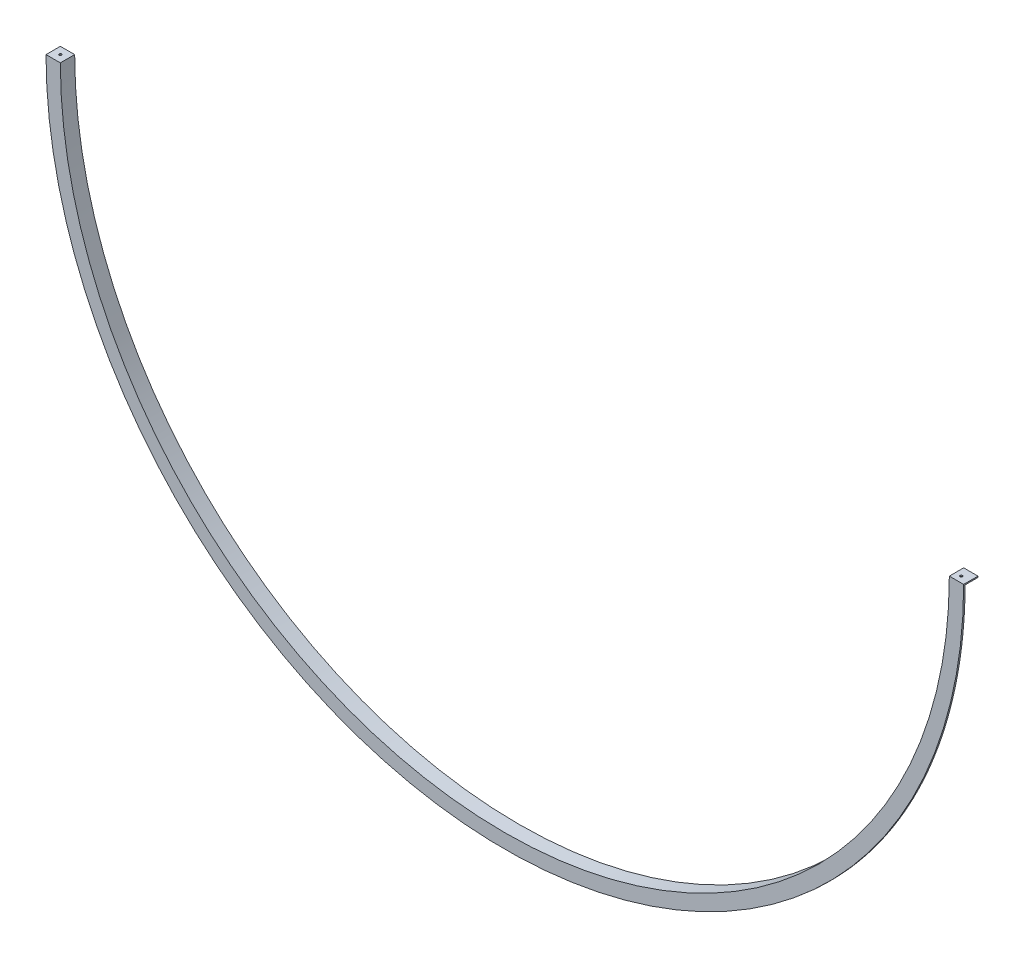
ISO-10303-21;
HEADER;
FILE_DESCRIPTION(('STEP AP214'),'2;1');
FILE_NAME('part.step','',(''),(''),'','','');
FILE_SCHEMA(('AUTOMOTIVE_DESIGN { 1 0 10303 214 1 1 1 1 }'));
ENDSEC;
DATA;
#1=APPLICATION_CONTEXT('core data for automotive mechanical design processes');
#2=APPLICATION_PROTOCOL_DEFINITION('international standard','automotive_design',2000,#1);
#3=PRODUCT_CONTEXT('',#1,'mechanical');
#4=PRODUCT('Part','Part','',(#3));
#5=PRODUCT_RELATED_PRODUCT_CATEGORY('part','',(#4));
#6=PRODUCT_DEFINITION_FORMATION('','',#4);
#7=PRODUCT_DEFINITION_CONTEXT('part definition',#1,'design');
#8=PRODUCT_DEFINITION('design','',#6,#7);
#9=PRODUCT_DEFINITION_SHAPE('','',#8);
#10=(LENGTH_UNIT() NAMED_UNIT(*) SI_UNIT(.MILLI.,.METRE.));
#11=(NAMED_UNIT(*) PLANE_ANGLE_UNIT() SI_UNIT($,.RADIAN.));
#12=(NAMED_UNIT(*) SI_UNIT($,.STERADIAN.) SOLID_ANGLE_UNIT());
#13=UNCERTAINTY_MEASURE_WITH_UNIT(LENGTH_MEASURE(1.E-05),#10,'distance_accuracy_value','');
#14=(GEOMETRIC_REPRESENTATION_CONTEXT(3) GLOBAL_UNCERTAINTY_ASSIGNED_CONTEXT((#13)) GLOBAL_UNIT_ASSIGNED_CONTEXT((#10,
#11,#12)) REPRESENTATION_CONTEXT('',''));
#15=CARTESIAN_POINT('',(0.,0.,0.));
#16=DIRECTION('',(0.,0.,1.));
#17=DIRECTION('',(1.,0.,0.));
#18=AXIS2_PLACEMENT_3D('',#15,#16,#17);
#19=CARTESIAN_POINT('',(-1490.,0.,1.82472373072956E-13));
#20=DIRECTION('',(0.,0.,1.));
#21=DIRECTION('',(1.,0.,0.));
#22=AXIS2_PLACEMENT_3D('',#19,#20,#21);
#23=CYLINDRICAL_SURFACE('',#22,1538.06451612903);
#24=CARTESIAN_POINT('',(-1490.,0.,-4.80645161290322));
#25=DIRECTION('',(0.,0.,1.));
#26=DIRECTION('',(1.,0.,0.));
#27=AXIS2_PLACEMENT_3D('',#24,#25,#26);
#28=CIRCLE('',#27,1538.06451612903);
#29=CARTESIAN_POINT('',(-3028.06451612903,1.07402471120026E-11,-4.80645161290322));
#30=VERTEX_POINT('',#29);
#31=CARTESIAN_POINT('',(48.0593147779553,-4.00000000000034,-4.80645161290322));
#32=VERTEX_POINT('',#31);
#33=EDGE_CURVE('E248',#30,#32,#28,.T.);
#34=ORIENTED_EDGE('',*,*,#33,.T.);
#35=DIRECTION('',(0.,0.,1.));
#36=VECTOR('',#35,1.);
#37=CARTESIAN_POINT('',(48.0593147779553,-4.00000000000034,1.82472373072956E-13));
#38=LINE('',#37,#36);
#39=CARTESIAN_POINT('',(48.0593147779553,-4.00000000000034,0.));
#40=VERTEX_POINT('',#39);
#41=EDGE_CURVE('E167',#32,#40,#38,.T.);
#42=ORIENTED_EDGE('',*,*,#41,.T.);
#43=CARTESIAN_POINT('',(-1490.,0.,0.));
#44=DIRECTION('',(0.,0.,1.));
#45=DIRECTION('',(1.,0.,0.));
#46=AXIS2_PLACEMENT_3D('',#43,#44,#45);
#47=CIRCLE('',#46,1538.06451612903);
#48=CARTESIAN_POINT('',(-3028.06451612903,1.07402471120026E-11,0.));
#49=VERTEX_POINT('',#48);
#50=EDGE_CURVE('E128',#49,#40,#47,.T.);
#51=ORIENTED_EDGE('',*,*,#50,.F.);
#52=DIRECTION('',(0.,0.,-1.));
#53=VECTOR('',#52,1.);
#54=CARTESIAN_POINT('',(-3028.06451612903,1.07402471120026E-11,0.));
#55=LINE('',#54,#53);
#56=EDGE_CURVE('E223',#49,#30,#55,.T.);
#57=ORIENTED_EDGE('',*,*,#56,.T.);
#58=EDGE_LOOP('',(#34,#42,#51,#57));
#59=FACE_BOUND('',#58,.T.);
#60=ADVANCED_FACE('F39',(#59),#23,.T.);
#61=CARTESIAN_POINT('',(-3028.06451612903,1.07402471120026E-11,-4.80645161290322));
#62=DIRECTION('',(0.,0.,-1.));
#63=DIRECTION('',(-1.,0.,0.));
#64=AXIS2_PLACEMENT_3D('',#61,#62,#63);
#65=PLANE('',#64);
#66=CARTESIAN_POINT('',(-1490.,0.,-4.80645161290322));
#67=DIRECTION('',(0.,0.,1.));
#68=DIRECTION('',(1.,0.,0.));
#69=AXIS2_PLACEMENT_3D('',#66,#67,#68);
#70=CIRCLE('',#69,1494.8064516129);
#71=CARTESIAN_POINT('',(-2984.80109973988,-3.99999999997916,-4.80645161290322));
#72=VERTEX_POINT('',#71);
#73=CARTESIAN_POINT('',(4.80109973988152,-4.00000000000003,-4.80645161290322));
#74=VERTEX_POINT('',#73);
#75=EDGE_CURVE('E244',#72,#74,#70,.T.);
#76=ORIENTED_EDGE('',*,*,#75,.T.);
#77=DIRECTION('',(1.,0.,0.));
#78=VECTOR('',#77,1.);
#79=CARTESIAN_POINT('',(-3028.06451612903,-3.99999999997886,-4.80645161290322));
#80=LINE('',#79,#78);
#81=EDGE_CURVE('E163',#74,#32,#80,.T.);
#82=ORIENTED_EDGE('',*,*,#81,.T.);
#83=ORIENTED_EDGE('',*,*,#33,.F.);
#84=DIRECTION('',(1.,0.,0.));
#85=VECTOR('',#84,1.);
#86=CARTESIAN_POINT('',(-3028.06451612903,1.07402471120026E-11,-4.80645161290322));
#87=LINE('',#86,#85);
#88=CARTESIAN_POINT('',(-3028.,1.07397965982815E-11,-4.80645161290322));
#89=VERTEX_POINT('',#88);
#90=EDGE_CURVE('E227',#30,#89,#87,.T.);
#91=ORIENTED_EDGE('',*,*,#90,.T.);
#92=DIRECTION('',(0.,1.,0.));
#93=VECTOR('',#92,1.);
#94=CARTESIAN_POINT('',(-3028.,1.07397965982815E-11,-4.80645161290322));
#95=LINE('',#94,#93);
#96=CARTESIAN_POINT('',(-3028.,-3.99999999997886,-4.80645161290322));
#97=VERTEX_POINT('',#96);
#98=EDGE_CURVE('E55',#97,#89,#95,.T.);
#99=ORIENTED_EDGE('',*,*,#98,.F.);
#100=DIRECTION('',(1.,0.,0.));
#101=VECTOR('',#100,1.);
#102=CARTESIAN_POINT('',(-3028.06451612903,-3.99999999997886,-4.80645161290322));
#103=LINE('',#102,#101);
#104=EDGE_CURVE('E201',#97,#72,#103,.T.);
#105=ORIENTED_EDGE('',*,*,#104,.T.);
#106=EDGE_LOOP('',(#76,#82,#83,#91,#99,#105));
#107=FACE_BOUND('',#106,.T.);
#108=ADVANCED_FACE('F273',(#107),#65,.T.);
#109=CARTESIAN_POINT('',(-1490.,0.,1.82472373072956E-13));
#110=DIRECTION('',(0.,0.,1.));
#111=DIRECTION('',(1.,0.,0.));
#112=AXIS2_PLACEMENT_3D('',#109,#110,#111);
#113=CYLINDRICAL_SURFACE('',#112,1494.8064516129);
#114=CARTESIAN_POINT('',(-1490.,0.,-48.0645161290322));
#115=DIRECTION('',(0.,0.,1.));
#116=DIRECTION('',(1.,0.,0.));
#117=AXIS2_PLACEMENT_3D('',#114,#115,#116);
#118=CIRCLE('',#117,1494.8064516129);
#119=CARTESIAN_POINT('',(-2984.8064516129,1.04381776619775E-11,-48.0645161290322));
#120=VERTEX_POINT('',#119);
#121=CARTESIAN_POINT('',(4.80109973988152,-4.00000000000003,-48.0645161290322));
#122=VERTEX_POINT('',#121);
#123=EDGE_CURVE('E240',#120,#122,#118,.T.);
#124=ORIENTED_EDGE('',*,*,#123,.T.);
#125=DIRECTION('',(0.,0.,1.));
#126=VECTOR('',#125,1.);
#127=CARTESIAN_POINT('',(4.80109973988152,-4.00000000000003,1.82472373072956E-13));
#128=LINE('',#127,#126);
#129=EDGE_CURVE('E158',#122,#74,#128,.T.);
#130=ORIENTED_EDGE('',*,*,#129,.T.);
#131=ORIENTED_EDGE('',*,*,#75,.F.);
#132=DIRECTION('',(0.,0.,1.));
#133=VECTOR('',#132,1.);
#134=CARTESIAN_POINT('',(-2984.80109973988,-3.99999999997916,1.82472373072956E-13));
#135=LINE('',#134,#133);
#136=CARTESIAN_POINT('',(-2984.80109973988,-3.99999999997916,-48.));
#137=VERTEX_POINT('',#136);
#138=EDGE_CURVE('E11',#72,#137,#135,.F.);
#139=ORIENTED_EDGE('',*,*,#138,.T.);
#140=CARTESIAN_POINT('',(-1490.,0.,-48.0000000000002));
#141=DIRECTION('',(0.,0.,-1.));
#142=DIRECTION('',(-1.,0.,0.));
#143=AXIS2_PLACEMENT_3D('',#140,#141,#142);
#144=CIRCLE('',#143,1494.8064516129);
#145=CARTESIAN_POINT('',(-2984.8064516129,2.08427920517301E-11,-48.));
#146=VERTEX_POINT('',#145);
#147=EDGE_CURVE('E196',#146,#137,#144,.F.);
#148=ORIENTED_EDGE('',*,*,#147,.F.);
#149=DIRECTION('',(0.,0.,-1.));
#150=VECTOR('',#149,1.);
#151=CARTESIAN_POINT('',(-2984.8064516129,1.04381776619775E-11,-4.80645161290322));
#152=LINE('',#151,#150);
#153=EDGE_CURVE('E230',#146,#120,#152,.T.);
#154=ORIENTED_EDGE('',*,*,#153,.T.);
#155=EDGE_LOOP('',(#124,#130,#131,#139,#148,#154));
#156=FACE_BOUND('',#155,.T.);
#157=ADVANCED_FACE('F274',(#156),#113,.T.);
#158=CARTESIAN_POINT('',(-1490.,0.,1.82472373072956E-13));
#159=DIRECTION('',(0.,0.,1.));
#160=DIRECTION('',(1.,0.,0.));
#161=AXIS2_PLACEMENT_3D('',#158,#159,#160);
#162=CYLINDRICAL_SURFACE('',#161,1490.);
#163=CARTESIAN_POINT('',(-1490.,0.,0.));
#164=DIRECTION('',(0.,0.,1.));
#165=DIRECTION('',(1.,0.,0.));
#166=AXIS2_PLACEMENT_3D('',#163,#164,#165);
#167=CIRCLE('',#166,1490.);
#168=CARTESIAN_POINT('',(-2980.,1.04046143897525E-11,0.));
#169=VERTEX_POINT('',#168);
#170=CARTESIAN_POINT('',(0.,0.,0.));
#171=VERTEX_POINT('',#170);
#172=EDGE_CURVE('E48',#169,#171,#167,.T.);
#173=ORIENTED_EDGE('',*,*,#172,.T.);
#174=DIRECTION('',(0.,0.,1.));
#175=VECTOR('',#174,1.);
#176=CARTESIAN_POINT('',(0.,0.,-48.0645161290322));
#177=LINE('',#176,#175);
#178=CARTESIAN_POINT('',(0.,0.,-48.0645161290322));
#179=VERTEX_POINT('',#178);
#180=EDGE_CURVE('E204',#179,#171,#177,.T.);
#181=ORIENTED_EDGE('',*,*,#180,.F.);
#182=CARTESIAN_POINT('',(-1490.,0.,-48.0645161290322));
#183=DIRECTION('',(0.,0.,1.));
#184=DIRECTION('',(1.,0.,0.));
#185=AXIS2_PLACEMENT_3D('',#182,#183,#184);
#186=CIRCLE('',#185,1490.);
#187=CARTESIAN_POINT('',(-2980.,1.04046143897525E-11,-48.0645161290322));
#188=VERTEX_POINT('',#187);
#189=EDGE_CURVE('E237',#188,#179,#186,.T.);
#190=ORIENTED_EDGE('',*,*,#189,.F.);
#191=DIRECTION('',(0.,0.,1.));
#192=VECTOR('',#191,1.);
#193=CARTESIAN_POINT('',(-2980.,1.04046143897525E-11,-48.0645161290322));
#194=LINE('',#193,#192);
#195=EDGE_CURVE('E217',#188,#169,#194,.T.);
#196=ORIENTED_EDGE('',*,*,#195,.T.);
#197=EDGE_LOOP('',(#173,#181,#190,#196));
#198=FACE_BOUND('',#197,.T.);
#199=ADVANCED_FACE('F257',(#198),#162,.F.);
#200=CARTESIAN_POINT('',(-2980.,1.04046143897525E-11,0.));
#201=DIRECTION('',(0.,0.,1.));
#202=DIRECTION('',(1.,0.,0.));
#203=AXIS2_PLACEMENT_3D('',#200,#201,#202);
#204=PLANE('',#203);
#205=DIRECTION('',(1.,0.,0.));
#206=VECTOR('',#205,1.);
#207=CARTESIAN_POINT('',(0.,0.,0.));
#208=LINE('',#207,#206);
#209=CARTESIAN_POINT('',(48.0645161290322,-3.35632722250082E-13,0.));
#210=VERTEX_POINT('',#209);
#211=EDGE_CURVE('E208',#171,#210,#208,.T.);
#212=ORIENTED_EDGE('',*,*,#211,.F.);
#213=ORIENTED_EDGE('',*,*,#172,.F.);
#214=DIRECTION('',(-1.,0.,0.));
#215=VECTOR('',#214,1.);
#216=CARTESIAN_POINT('',(-2980.,1.04046143897525E-11,0.));
#217=LINE('',#216,#215);
#218=EDGE_CURVE('E220',#169,#49,#217,.T.);
#219=ORIENTED_EDGE('',*,*,#218,.T.);
#220=ORIENTED_EDGE('',*,*,#50,.T.);
#221=DIRECTION('',(1.,0.,0.));
#222=VECTOR('',#221,1.);
#223=CARTESIAN_POINT('',(0.,-4.,0.));
#224=LINE('',#223,#222);
#225=CARTESIAN_POINT('',(48.0645161290322,-4.00000000000034,0.));
#226=VERTEX_POINT('',#225);
#227=EDGE_CURVE('E122',#40,#226,#224,.T.);
#228=ORIENTED_EDGE('',*,*,#227,.T.);
#229=DIRECTION('',(0.,1.,0.));
#230=VECTOR('',#229,1.);
#231=CARTESIAN_POINT('',(48.0645161290322,-4.00000000000034,0.));
#232=LINE('',#231,#230);
#233=EDGE_CURVE('E125',#226,#210,#232,.T.);
#234=ORIENTED_EDGE('',*,*,#233,.T.);
#235=EDGE_LOOP('',(#212,#213,#219,#220,#228,#234));
#236=FACE_BOUND('',#235,.T.);
#237=ADVANCED_FACE('F41',(#236),#204,.T.);
#238=CARTESIAN_POINT('',(-2984.8064516129,1.04381776619775E-11,-48.0645161290322));
#239=DIRECTION('',(0.,0.,-1.));
#240=DIRECTION('',(-1.,0.,0.));
#241=AXIS2_PLACEMENT_3D('',#238,#239,#240);
#242=PLANE('',#241);
#243=ORIENTED_EDGE('',*,*,#189,.T.);
#244=DIRECTION('',(-1.,0.,0.));
#245=VECTOR('',#244,1.);
#246=CARTESIAN_POINT('',(4.80645161290323,0.,-48.0645161290322));
#247=LINE('',#246,#245);
#248=CARTESIAN_POINT('',(48.0645161290322,-3.35632722250082E-13,-48.0645161290322));
#249=VERTEX_POINT('',#248);
#250=EDGE_CURVE('E213',#249,#179,#247,.T.);
#251=ORIENTED_EDGE('',*,*,#250,.F.);
#252=DIRECTION('',(0.,1.,0.));
#253=VECTOR('',#252,1.);
#254=CARTESIAN_POINT('',(48.0645161290322,-4.00000000000034,-48.0645161290322));
#255=LINE('',#254,#253);
#256=CARTESIAN_POINT('',(48.0645161290322,-4.00000000000034,-48.0645161290322));
#257=VERTEX_POINT('',#256);
#258=EDGE_CURVE('E145',#257,#249,#255,.T.);
#259=ORIENTED_EDGE('',*,*,#258,.F.);
#260=DIRECTION('',(-1.,0.,0.));
#261=VECTOR('',#260,1.);
#262=CARTESIAN_POINT('',(48.0645161290322,-4.00000000000034,-48.0645161290322));
#263=LINE('',#262,#261);
#264=EDGE_CURVE('E146',#257,#122,#263,.T.);
#265=ORIENTED_EDGE('',*,*,#264,.T.);
#266=ORIENTED_EDGE('',*,*,#123,.F.);
#267=DIRECTION('',(1.,0.,0.));
#268=VECTOR('',#267,1.);
#269=CARTESIAN_POINT('',(-2984.8064516129,1.04381776619775E-11,-48.0645161290322));
#270=LINE('',#269,#268);
#271=EDGE_CURVE('E233',#120,#188,#270,.T.);
#272=ORIENTED_EDGE('',*,*,#271,.T.);
#273=EDGE_LOOP('',(#243,#251,#259,#265,#266,#272));
#274=FACE_BOUND('',#273,.T.);
#275=ADVANCED_FACE('F264',(#274),#242,.T.);
#276=CARTESIAN_POINT('',(-2980.,1.04046143897525E-11,0.));
#277=DIRECTION('',(0.,-1.,0.));
#278=DIRECTION('',(0.,0.,1.));
#279=AXIS2_PLACEMENT_3D('',#276,#277,#278);
#280=PLANE('',#279);
#281=ORIENTED_EDGE('',*,*,#153,.F.);
#282=DIRECTION('',(-1.,0.,0.));
#283=VECTOR('',#282,1.);
#284=CARTESIAN_POINT('',(-2980.,2.08092287795051E-11,-48.));
#285=LINE('',#284,#283);
#286=CARTESIAN_POINT('',(-3028.,2.1144410988034E-11,-48.));
#287=VERTEX_POINT('',#286);
#288=EDGE_CURVE('E175',#146,#287,#285,.T.);
#289=ORIENTED_EDGE('',*,*,#288,.T.);
#290=DIRECTION('',(0.,0.,1.));
#291=VECTOR('',#290,1.);
#292=CARTESIAN_POINT('',(-3028.,2.1144410988034E-11,0.));
#293=LINE('',#292,#291);
#294=EDGE_CURVE('E183',#287,#89,#293,.T.);
#295=ORIENTED_EDGE('',*,*,#294,.T.);
#296=ORIENTED_EDGE('',*,*,#90,.F.);
#297=ORIENTED_EDGE('',*,*,#56,.F.);
#298=ORIENTED_EDGE('',*,*,#218,.F.);
#299=ORIENTED_EDGE('',*,*,#195,.F.);
#300=ORIENTED_EDGE('',*,*,#271,.F.);
#301=EDGE_LOOP('',(#281,#289,#295,#296,#297,#298,#299,#300));
#302=FACE_BOUND('',#301,.T.);
#303=CARTESIAN_POINT('',(-3004.,2.09768198837695E-11,-24.0322580645161));
#304=DIRECTION('',(0.,1.,0.));
#305=DIRECTION('',(-1.,0.,0.));
#306=AXIS2_PLACEMENT_3D('',#303,#304,#305);
#307=CIRCLE('',#306,4.00000000000021);
#308=CARTESIAN_POINT('',(-3008.,2.10047517344803E-11,-24.0322580645161));
#309=VERTEX_POINT('',#308);
#310=EDGE_CURVE('E170',#309,#309,#307,.T.);
#311=ORIENTED_EDGE('',*,*,#310,.F.);
#312=EDGE_LOOP('',(#311));
#313=FACE_BOUND('',#312,.T.);
#314=ADVANCED_FACE('F268',(#302,#313),#280,.F.);
#315=CARTESIAN_POINT('',(0.,0.,0.));
#316=DIRECTION('',(0.,1.,0.));
#317=DIRECTION('',(0.,0.,1.));
#318=AXIS2_PLACEMENT_3D('',#315,#316,#317);
#319=PLANE('',#318);
#320=ORIENTED_EDGE('',*,*,#180,.T.);
#321=ORIENTED_EDGE('',*,*,#211,.T.);
#322=DIRECTION('',(0.,0.,-1.));
#323=VECTOR('',#322,1.);
#324=CARTESIAN_POINT('',(48.0645161290322,0.,0.));
#325=LINE('',#324,#323);
#326=EDGE_CURVE('E142',#210,#249,#325,.T.);
#327=ORIENTED_EDGE('',*,*,#326,.T.);
#328=ORIENTED_EDGE('',*,*,#250,.T.);
#329=EDGE_LOOP('',(#320,#321,#327,#328));
#330=FACE_BOUND('',#329,.T.);
#331=CARTESIAN_POINT('',(20.,-1.39659253553725E-13,-20.));
#332=DIRECTION('',(0.,1.,0.));
#333=DIRECTION('',(-1.,0.,0.));
#334=AXIS2_PLACEMENT_3D('',#331,#332,#333);
#335=CIRCLE('',#334,4.);
#336=CARTESIAN_POINT('',(16.,-1.1172740284298E-13,-20.));
#337=VERTEX_POINT('',#336);
#338=EDGE_CURVE('E381',#337,#337,#335,.T.);
#339=ORIENTED_EDGE('',*,*,#338,.F.);
#340=EDGE_LOOP('',(#339));
#341=FACE_BOUND('',#340,.T.);
#342=ADVANCED_FACE('F261',(#330,#341),#319,.T.);
#343=CARTESIAN_POINT('',(-3028.,-3.99999999997886,0.));
#344=DIRECTION('',(-1.,0.,0.));
#345=DIRECTION('',(0.,-1.,0.));
#346=AXIS2_PLACEMENT_3D('',#343,#344,#345);
#347=PLANE('',#346);
#348=DIRECTION('',(0.,0.,1.));
#349=VECTOR('',#348,1.);
#350=CARTESIAN_POINT('',(-3028.,-3.99999999997886,0.));
#351=LINE('',#350,#349);
#352=CARTESIAN_POINT('',(-3028.,-3.99999999997886,-48.));
#353=VERTEX_POINT('',#352);
#354=EDGE_CURVE('E182',#353,#97,#351,.T.);
#355=ORIENTED_EDGE('',*,*,#354,.T.);
#356=ORIENTED_EDGE('',*,*,#98,.T.);
#357=ORIENTED_EDGE('',*,*,#294,.F.);
#358=DIRECTION('',(0.,1.,0.));
#359=VECTOR('',#358,1.);
#360=CARTESIAN_POINT('',(-3028.,-3.99999999997886,-48.));
#361=LINE('',#360,#359);
#362=EDGE_CURVE('E187',#353,#287,#361,.T.);
#363=ORIENTED_EDGE('',*,*,#362,.F.);
#364=EDGE_LOOP('',(#355,#356,#357,#363));
#365=FACE_BOUND('',#364,.T.);
#366=ADVANCED_FACE('F286',(#365),#347,.T.);
#367=CARTESIAN_POINT('',(-2980.,-3.99999999997919,-48.));
#368=DIRECTION('',(0.,0.,-1.));
#369=DIRECTION('',(-1.,0.,0.));
#370=AXIS2_PLACEMENT_3D('',#367,#368,#369);
#371=PLANE('',#370);
#372=ORIENTED_EDGE('',*,*,#288,.F.);
#373=ORIENTED_EDGE('',*,*,#147,.T.);
#374=DIRECTION('',(-1.,0.,0.));
#375=VECTOR('',#374,1.);
#376=CARTESIAN_POINT('',(-2980.,-3.99999999997919,-48.));
#377=LINE('',#376,#375);
#378=EDGE_CURVE('E179',#137,#353,#377,.T.);
#379=ORIENTED_EDGE('',*,*,#378,.T.);
#380=ORIENTED_EDGE('',*,*,#362,.T.);
#381=EDGE_LOOP('',(#372,#373,#379,#380));
#382=FACE_BOUND('',#381,.T.);
#383=ADVANCED_FACE('F283',(#382),#371,.T.);
#384=CARTESIAN_POINT('',(0.,-4.,0.));
#385=DIRECTION('',(0.,1.,0.));
#386=DIRECTION('',(-1.,0.,0.));
#387=AXIS2_PLACEMENT_3D('',#384,#385,#386);
#388=PLANE('',#387);
#389=ORIENTED_EDGE('',*,*,#104,.F.);
#390=ORIENTED_EDGE('',*,*,#354,.F.);
#391=ORIENTED_EDGE('',*,*,#378,.F.);
#392=ORIENTED_EDGE('',*,*,#138,.F.);
#393=EDGE_LOOP('',(#389,#390,#391,#392));
#394=FACE_BOUND('',#393,.T.);
#395=CARTESIAN_POINT('',(-3004.,-3.99999999997902,-24.0322580645161));
#396=DIRECTION('',(0.,1.,0.));
#397=DIRECTION('',(-1.,0.,0.));
#398=AXIS2_PLACEMENT_3D('',#395,#396,#397);
#399=CIRCLE('',#398,4.00000000000021);
#400=CARTESIAN_POINT('',(-3008.,-3.999999999979,-24.0322580645161));
#401=VERTEX_POINT('',#400);
#402=EDGE_CURVE('E171',#401,#401,#399,.T.);
#403=ORIENTED_EDGE('',*,*,#402,.T.);
#404=EDGE_LOOP('',(#403));
#405=FACE_BOUND('',#404,.T.);
#406=ADVANCED_FACE('F277',(#394,#405),#388,.F.);
#407=CARTESIAN_POINT('',(-3004.,-3.99999999997902,-24.0322580645161));
#408=DIRECTION('',(0.,1.,0.));
#409=DIRECTION('',(-1.,0.,0.));
#410=AXIS2_PLACEMENT_3D('',#407,#408,#409);
#411=CYLINDRICAL_SURFACE('',#410,4.00000000000021);
#412=ORIENTED_EDGE('',*,*,#402,.F.);
#413=EDGE_LOOP('',(#412));
#414=FACE_BOUND('',#413,.T.);
#415=ORIENTED_EDGE('',*,*,#310,.T.);
#416=EDGE_LOOP('',(#415));
#417=FACE_BOUND('',#416,.T.);
#418=ADVANCED_FACE('F338',(#414,#417),#411,.F.);
#419=CARTESIAN_POINT('',(48.0645161290322,-4.00000000000034,0.));
#420=DIRECTION('',(1.,0.,0.));
#421=DIRECTION('',(0.,1.,0.));
#422=AXIS2_PLACEMENT_3D('',#419,#420,#421);
#423=PLANE('',#422);
#424=ORIENTED_EDGE('',*,*,#326,.F.);
#425=ORIENTED_EDGE('',*,*,#233,.F.);
#426=DIRECTION('',(0.,0.,-1.));
#427=VECTOR('',#426,1.);
#428=CARTESIAN_POINT('',(48.0645161290322,-4.00000000000034,0.));
#429=LINE('',#428,#427);
#430=EDGE_CURVE('E133',#226,#257,#429,.T.);
#431=ORIENTED_EDGE('',*,*,#430,.T.);
#432=ORIENTED_EDGE('',*,*,#258,.T.);
#433=EDGE_LOOP('',(#424,#425,#431,#432));
#434=FACE_BOUND('',#433,.T.);
#435=ADVANCED_FACE('F138',(#434),#423,.T.);
#436=CARTESIAN_POINT('',(0.,-4.,0.));
#437=DIRECTION('',(0.,1.,0.));
#438=DIRECTION('',(-1.,0.,0.));
#439=AXIS2_PLACEMENT_3D('',#436,#437,#438);
#440=PLANE('',#439);
#441=ORIENTED_EDGE('',*,*,#41,.F.);
#442=ORIENTED_EDGE('',*,*,#81,.F.);
#443=ORIENTED_EDGE('',*,*,#129,.F.);
#444=ORIENTED_EDGE('',*,*,#264,.F.);
#445=ORIENTED_EDGE('',*,*,#430,.F.);
#446=ORIENTED_EDGE('',*,*,#227,.F.);
#447=EDGE_LOOP('',(#441,#442,#443,#444,#445,#446));
#448=FACE_BOUND('',#447,.T.);
#449=CARTESIAN_POINT('',(20.,-4.00000000000014,-20.));
#450=DIRECTION('',(0.,1.,0.));
#451=DIRECTION('',(-1.,0.,0.));
#452=AXIS2_PLACEMENT_3D('',#449,#450,#451);
#453=CIRCLE('',#452,4.);
#454=CARTESIAN_POINT('',(16.,-4.00000000000011,-20.));
#455=VERTEX_POINT('',#454);
#456=EDGE_CURVE('E134',#455,#455,#453,.T.);
#457=ORIENTED_EDGE('',*,*,#456,.T.);
#458=EDGE_LOOP('',(#457));
#459=FACE_BOUND('',#458,.T.);
#460=ADVANCED_FACE('F148',(#448,#459),#440,.F.);
#461=CARTESIAN_POINT('',(20.,-4.00000000000014,-20.));
#462=DIRECTION('',(0.,1.,0.));
#463=DIRECTION('',(-1.,0.,0.));
#464=AXIS2_PLACEMENT_3D('',#461,#462,#463);
#465=CYLINDRICAL_SURFACE('',#464,4.);
#466=ORIENTED_EDGE('',*,*,#456,.F.);
#467=EDGE_LOOP('',(#466));
#468=FACE_BOUND('',#467,.T.);
#469=ORIENTED_EDGE('',*,*,#338,.T.);
#470=EDGE_LOOP('',(#469));
#471=FACE_BOUND('',#470,.T.);
#472=ADVANCED_FACE('F363',(#468,#471),#465,.F.);
#473=CLOSED_SHELL('',(#60,#108,#157,#199,#237,#275,#314,#342,#366,#383,#406,#418,#435,#460,#472));
#474=MANIFOLD_SOLID_BREP('B2',#473);
#475=ADVANCED_BREP_SHAPE_REPRESENTATION('',(#18,#474),#14);
#476=SHAPE_DEFINITION_REPRESENTATION(#9,#475);
ENDSEC;
END-ISO-10303-21;
